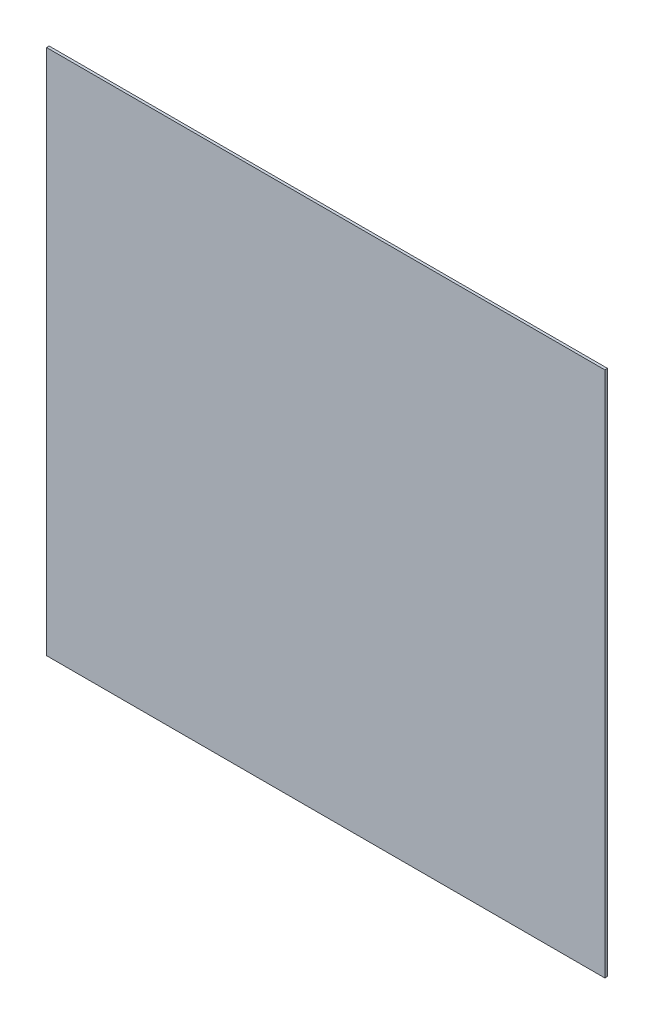
ISO-10303-21;
HEADER;
FILE_DESCRIPTION(('STEP AP214'),'2;1');
FILE_NAME('part.step','',(''),(''),'','','');
FILE_SCHEMA(('AUTOMOTIVE_DESIGN { 1 0 10303 214 1 1 1 1 }'));
ENDSEC;
DATA;
#1=APPLICATION_CONTEXT('core data for automotive mechanical design processes');
#2=APPLICATION_PROTOCOL_DEFINITION('international standard','automotive_design',2000,#1);
#3=PRODUCT_CONTEXT('',#1,'mechanical');
#4=PRODUCT('Part','Part','',(#3));
#5=PRODUCT_RELATED_PRODUCT_CATEGORY('part','',(#4));
#6=PRODUCT_DEFINITION_FORMATION('','',#4);
#7=PRODUCT_DEFINITION_CONTEXT('part definition',#1,'design');
#8=PRODUCT_DEFINITION('design','',#6,#7);
#9=PRODUCT_DEFINITION_SHAPE('','',#8);
#10=(LENGTH_UNIT() NAMED_UNIT(*) SI_UNIT(.MILLI.,.METRE.));
#11=(NAMED_UNIT(*) PLANE_ANGLE_UNIT() SI_UNIT($,.RADIAN.));
#12=(NAMED_UNIT(*) SI_UNIT($,.STERADIAN.) SOLID_ANGLE_UNIT());
#13=UNCERTAINTY_MEASURE_WITH_UNIT(LENGTH_MEASURE(1.E-05),#10,'distance_accuracy_value','');
#14=(GEOMETRIC_REPRESENTATION_CONTEXT(3) GLOBAL_UNCERTAINTY_ASSIGNED_CONTEXT((#13)) GLOBAL_UNIT_ASSIGNED_CONTEXT((#10,
#11,#12)) REPRESENTATION_CONTEXT('',''));
#15=CARTESIAN_POINT('',(0.,0.,0.));
#16=DIRECTION('',(0.,0.,1.));
#17=DIRECTION('',(1.,0.,0.));
#18=AXIS2_PLACEMENT_3D('',#15,#16,#17);
#19=CARTESIAN_POINT('',(0.,0.,3.175));
#20=DIRECTION('',(0.,0.,1.));
#21=DIRECTION('',(1.,0.,0.));
#22=AXIS2_PLACEMENT_3D('',#19,#20,#21);
#23=PLANE('',#22);
#24=DIRECTION('',(0.,1.,0.));
#25=VECTOR('',#24,1.);
#26=CARTESIAN_POINT('',(0.,635.,3.175));
#27=LINE('',#26,#25);
#28=CARTESIAN_POINT('',(0.,0.,3.175));
#29=VERTEX_POINT('',#28);
#30=CARTESIAN_POINT('',(0.,635.,3.175));
#31=VERTEX_POINT('',#30);
#32=EDGE_CURVE('E67',#29,#31,#27,.T.);
#33=ORIENTED_EDGE('',*,*,#32,.F.);
#34=DIRECTION('',(1.,0.,0.));
#35=VECTOR('',#34,1.);
#36=CARTESIAN_POINT('',(0.,0.,3.175));
#37=LINE('',#36,#35);
#38=CARTESIAN_POINT('',(673.1,0.,3.175));
#39=VERTEX_POINT('',#38);
#40=EDGE_CURVE('E19',#39,#29,#37,.F.);
#41=ORIENTED_EDGE('',*,*,#40,.F.);
#42=DIRECTION('',(0.,1.,0.));
#43=VECTOR('',#42,1.);
#44=CARTESIAN_POINT('',(673.1,0.,3.175));
#45=LINE('',#44,#43);
#46=CARTESIAN_POINT('',(673.1,635.,3.175));
#47=VERTEX_POINT('',#46);
#48=EDGE_CURVE('E57',#47,#39,#45,.F.);
#49=ORIENTED_EDGE('',*,*,#48,.F.);
#50=DIRECTION('',(1.,0.,0.));
#51=VECTOR('',#50,1.);
#52=CARTESIAN_POINT('',(673.1,635.,3.175));
#53=LINE('',#52,#51);
#54=EDGE_CURVE('E52',#31,#47,#53,.T.);
#55=ORIENTED_EDGE('',*,*,#54,.F.);
#56=EDGE_LOOP('',(#33,#41,#49,#55));
#57=FACE_BOUND('',#56,.T.);
#58=ADVANCED_FACE('F16',(#57),#23,.T.);
#59=CARTESIAN_POINT('',(0.,0.,0.));
#60=DIRECTION('',(0.,-1.,0.));
#61=DIRECTION('',(0.,0.,-1.));
#62=AXIS2_PLACEMENT_3D('',#59,#60,#61);
#63=PLANE('',#62);
#64=DIRECTION('',(0.,0.,1.));
#65=VECTOR('',#64,1.);
#66=CARTESIAN_POINT('',(0.,0.,0.));
#67=LINE('',#66,#65);
#68=CARTESIAN_POINT('',(0.,0.,0.));
#69=VERTEX_POINT('',#68);
#70=EDGE_CURVE('E78',#69,#29,#67,.T.);
#71=ORIENTED_EDGE('',*,*,#70,.F.);
#72=DIRECTION('',(1.,0.,0.));
#73=VECTOR('',#72,1.);
#74=CARTESIAN_POINT('',(0.,0.,0.));
#75=LINE('',#74,#73);
#76=CARTESIAN_POINT('',(673.1,0.,0.));
#77=VERTEX_POINT('',#76);
#78=EDGE_CURVE('E73',#69,#77,#75,.T.);
#79=ORIENTED_EDGE('',*,*,#78,.T.);
#80=DIRECTION('',(0.,0.,-1.));
#81=VECTOR('',#80,1.);
#82=CARTESIAN_POINT('',(673.1,0.,0.));
#83=LINE('',#82,#81);
#84=EDGE_CURVE('E62',#39,#77,#83,.T.);
#85=ORIENTED_EDGE('',*,*,#84,.F.);
#86=ORIENTED_EDGE('',*,*,#40,.T.);
#87=EDGE_LOOP('',(#71,#79,#85,#86));
#88=FACE_BOUND('',#87,.T.);
#89=ADVANCED_FACE('F72',(#88),#63,.T.);
#90=CARTESIAN_POINT('',(673.1,0.,0.));
#91=DIRECTION('',(1.,0.,0.));
#92=DIRECTION('',(0.,0.,-1.));
#93=AXIS2_PLACEMENT_3D('',#90,#91,#92);
#94=PLANE('',#93);
#95=ORIENTED_EDGE('',*,*,#84,.T.);
#96=DIRECTION('',(0.,1.,0.));
#97=VECTOR('',#96,1.);
#98=CARTESIAN_POINT('',(673.1,0.,0.));
#99=LINE('',#98,#97);
#100=CARTESIAN_POINT('',(673.1,635.,0.));
#101=VERTEX_POINT('',#100);
#102=EDGE_CURVE('E83',#77,#101,#99,.T.);
#103=ORIENTED_EDGE('',*,*,#102,.T.);
#104=DIRECTION('',(0.,0.,1.));
#105=VECTOR('',#104,1.);
#106=CARTESIAN_POINT('',(673.1,635.,0.));
#107=LINE('',#106,#105);
#108=EDGE_CURVE('E64',#47,#101,#107,.F.);
#109=ORIENTED_EDGE('',*,*,#108,.F.);
#110=ORIENTED_EDGE('',*,*,#48,.T.);
#111=EDGE_LOOP('',(#95,#103,#109,#110));
#112=FACE_BOUND('',#111,.T.);
#113=ADVANCED_FACE('F59',(#112),#94,.T.);
#114=CARTESIAN_POINT('',(673.1,635.,0.));
#115=DIRECTION('',(0.,1.,0.));
#116=DIRECTION('',(0.,0.,1.));
#117=AXIS2_PLACEMENT_3D('',#114,#115,#116);
#118=PLANE('',#117);
#119=ORIENTED_EDGE('',*,*,#108,.T.);
#120=DIRECTION('',(1.,0.,0.));
#121=VECTOR('',#120,1.);
#122=CARTESIAN_POINT('',(0.,635.,0.));
#123=LINE('',#122,#121);
#124=CARTESIAN_POINT('',(0.,635.,0.));
#125=VERTEX_POINT('',#124);
#126=EDGE_CURVE('E25',#101,#125,#123,.F.);
#127=ORIENTED_EDGE('',*,*,#126,.T.);
#128=DIRECTION('',(0.,0.,1.));
#129=VECTOR('',#128,1.);
#130=CARTESIAN_POINT('',(0.,635.,0.));
#131=LINE('',#130,#129);
#132=EDGE_CURVE('E33',#31,#125,#131,.F.);
#133=ORIENTED_EDGE('',*,*,#132,.F.);
#134=ORIENTED_EDGE('',*,*,#54,.T.);
#135=EDGE_LOOP('',(#119,#127,#133,#134));
#136=FACE_BOUND('',#135,.T.);
#137=ADVANCED_FACE('F87',(#136),#118,.T.);
#138=CARTESIAN_POINT('',(0.,635.,0.));
#139=DIRECTION('',(-1.,0.,0.));
#140=DIRECTION('',(0.,0.,1.));
#141=AXIS2_PLACEMENT_3D('',#138,#139,#140);
#142=PLANE('',#141);
#143=ORIENTED_EDGE('',*,*,#132,.T.);
#144=DIRECTION('',(0.,1.,0.));
#145=VECTOR('',#144,1.);
#146=CARTESIAN_POINT('',(0.,0.,0.));
#147=LINE('',#146,#145);
#148=EDGE_CURVE('E11',#125,#69,#147,.F.);
#149=ORIENTED_EDGE('',*,*,#148,.T.);
#150=ORIENTED_EDGE('',*,*,#70,.T.);
#151=ORIENTED_EDGE('',*,*,#32,.T.);
#152=EDGE_LOOP('',(#143,#149,#150,#151));
#153=FACE_BOUND('',#152,.T.);
#154=ADVANCED_FACE('F90',(#153),#142,.T.);
#155=CARTESIAN_POINT('',(0.,0.,0.));
#156=DIRECTION('',(0.,0.,1.));
#157=DIRECTION('',(1.,0.,0.));
#158=AXIS2_PLACEMENT_3D('',#155,#156,#157);
#159=PLANE('',#158);
#160=ORIENTED_EDGE('',*,*,#126,.F.);
#161=ORIENTED_EDGE('',*,*,#102,.F.);
#162=ORIENTED_EDGE('',*,*,#78,.F.);
#163=ORIENTED_EDGE('',*,*,#148,.F.);
#164=EDGE_LOOP('',(#160,#161,#162,#163));
#165=FACE_BOUND('',#164,.T.);
#166=ADVANCED_FACE('F89',(#165),#159,.F.);
#167=CLOSED_SHELL('',(#58,#89,#113,#137,#154,#166));
#168=MANIFOLD_SOLID_BREP('B1',#167);
#169=ADVANCED_BREP_SHAPE_REPRESENTATION('',(#18,#168),#14);
#170=SHAPE_DEFINITION_REPRESENTATION(#9,#169);
ENDSEC;
END-ISO-10303-21;
